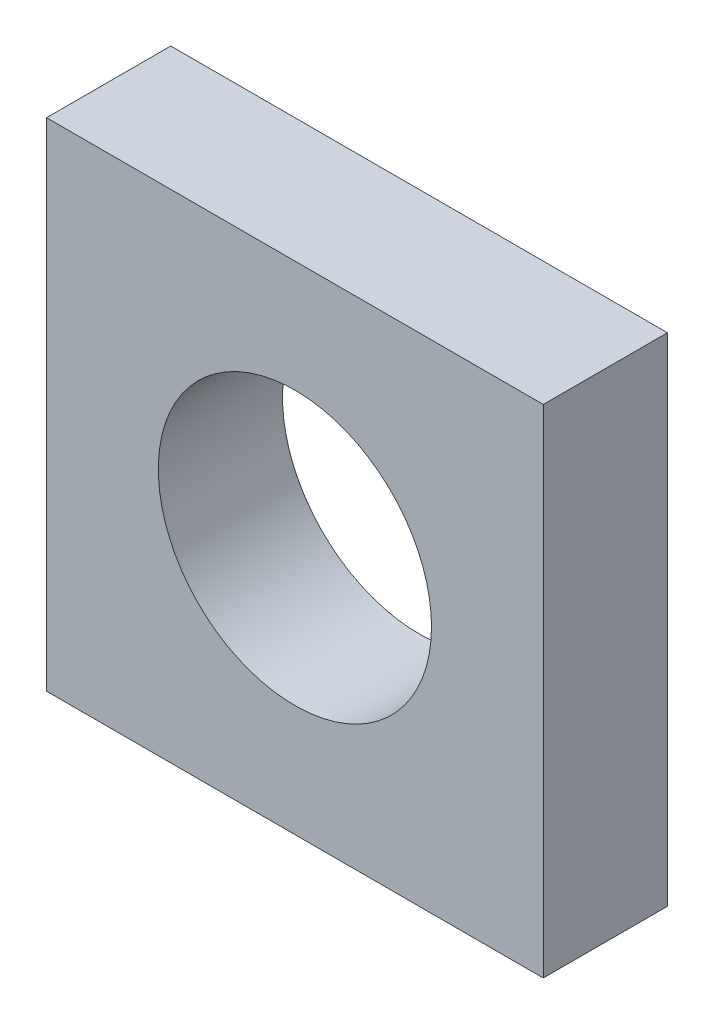
ISO-10303-21;
HEADER;
FILE_DESCRIPTION(('STEP AP214'),'2;1');
FILE_NAME('part.step','',(''),(''),'','','');
FILE_SCHEMA(('AUTOMOTIVE_DESIGN { 1 0 10303 214 1 1 1 1 }'));
ENDSEC;
DATA;
#1=APPLICATION_CONTEXT('core data for automotive mechanical design processes');
#2=APPLICATION_PROTOCOL_DEFINITION('international standard','automotive_design',2000,#1);
#3=PRODUCT_CONTEXT('',#1,'mechanical');
#4=PRODUCT('Part','Part','',(#3));
#5=PRODUCT_RELATED_PRODUCT_CATEGORY('part','',(#4));
#6=PRODUCT_DEFINITION_FORMATION('','',#4);
#7=PRODUCT_DEFINITION_CONTEXT('part definition',#1,'design');
#8=PRODUCT_DEFINITION('design','',#6,#7);
#9=PRODUCT_DEFINITION_SHAPE('','',#8);
#10=(LENGTH_UNIT() NAMED_UNIT(*) SI_UNIT(.MILLI.,.METRE.));
#11=(NAMED_UNIT(*) PLANE_ANGLE_UNIT() SI_UNIT($,.RADIAN.));
#12=(NAMED_UNIT(*) SI_UNIT($,.STERADIAN.) SOLID_ANGLE_UNIT());
#13=UNCERTAINTY_MEASURE_WITH_UNIT(LENGTH_MEASURE(1.E-05),#10,'distance_accuracy_value','');
#14=(GEOMETRIC_REPRESENTATION_CONTEXT(3) GLOBAL_UNCERTAINTY_ASSIGNED_CONTEXT((#13)) GLOBAL_UNIT_ASSIGNED_CONTEXT((#10,
#11,#12)) REPRESENTATION_CONTEXT('',''));
#15=CARTESIAN_POINT('',(0.,0.,0.));
#16=DIRECTION('',(0.,0.,1.));
#17=DIRECTION('',(1.,0.,0.));
#18=AXIS2_PLACEMENT_3D('',#15,#16,#17);
#19=CARTESIAN_POINT('',(0.,0.,10.));
#20=DIRECTION('',(0.,0.,-1.));
#21=DIRECTION('',(-1.,0.,0.));
#22=AXIS2_PLACEMENT_3D('',#19,#20,#21);
#23=PLANE('',#22);
#24=DIRECTION('',(0.,1.,0.));
#25=VECTOR('',#24,1.);
#26=CARTESIAN_POINT('',(20.,-20.,10.));
#27=LINE('',#26,#25);
#28=CARTESIAN_POINT('',(20.,-20.,10.));
#29=VERTEX_POINT('',#28);
#30=CARTESIAN_POINT('',(20.,20.,10.));
#31=VERTEX_POINT('',#30);
#32=EDGE_CURVE('E88',#29,#31,#27,.T.);
#33=ORIENTED_EDGE('',*,*,#32,.T.);
#34=DIRECTION('',(-1.,0.,0.));
#35=VECTOR('',#34,1.);
#36=CARTESIAN_POINT('',(-20.,20.,10.));
#37=LINE('',#36,#35);
#38=CARTESIAN_POINT('',(-20.,20.,10.));
#39=VERTEX_POINT('',#38);
#40=EDGE_CURVE('E83',#31,#39,#37,.T.);
#41=ORIENTED_EDGE('',*,*,#40,.T.);
#42=DIRECTION('',(0.,-1.,0.));
#43=VECTOR('',#42,1.);
#44=CARTESIAN_POINT('',(-20.,-20.,10.));
#45=LINE('',#44,#43);
#46=CARTESIAN_POINT('',(-20.,-20.,10.));
#47=VERTEX_POINT('',#46);
#48=EDGE_CURVE('E86',#39,#47,#45,.T.);
#49=ORIENTED_EDGE('',*,*,#48,.T.);
#50=DIRECTION('',(1.,0.,0.));
#51=VECTOR('',#50,1.);
#52=CARTESIAN_POINT('',(-20.,-20.,10.));
#53=LINE('',#52,#51);
#54=EDGE_CURVE('E53',#47,#29,#53,.T.);
#55=ORIENTED_EDGE('',*,*,#54,.T.);
#56=EDGE_LOOP('',(#33,#41,#49,#55));
#57=FACE_BOUND('',#56,.T.);
#58=CARTESIAN_POINT('',(0.,0.,10.));
#59=DIRECTION('',(0.,0.,1.));
#60=DIRECTION('',(1.,0.,0.));
#61=AXIS2_PLACEMENT_3D('',#58,#59,#60);
#62=CIRCLE('',#61,11.);
#63=CARTESIAN_POINT('',(11.,0.,10.));
#64=VERTEX_POINT('',#63);
#65=EDGE_CURVE('E103',#64,#64,#62,.T.);
#66=ORIENTED_EDGE('',*,*,#65,.F.);
#67=EDGE_LOOP('',(#66));
#68=FACE_BOUND('',#67,.T.);
#69=ADVANCED_FACE('F36',(#57,#68),#23,.F.);
#70=CARTESIAN_POINT('',(0.,0.,0.));
#71=DIRECTION('',(0.,0.,-1.));
#72=DIRECTION('',(-1.,0.,0.));
#73=AXIS2_PLACEMENT_3D('',#70,#71,#72);
#74=PLANE('',#73);
#75=DIRECTION('',(0.,1.,0.));
#76=VECTOR('',#75,1.);
#77=CARTESIAN_POINT('',(20.,-20.,0.));
#78=LINE('',#77,#76);
#79=CARTESIAN_POINT('',(20.,-20.,0.));
#80=VERTEX_POINT('',#79);
#81=CARTESIAN_POINT('',(20.,20.,0.));
#82=VERTEX_POINT('',#81);
#83=EDGE_CURVE('E100',#80,#82,#78,.T.);
#84=ORIENTED_EDGE('',*,*,#83,.F.);
#85=DIRECTION('',(1.,0.,0.));
#86=VECTOR('',#85,1.);
#87=CARTESIAN_POINT('',(-20.,-20.,0.));
#88=LINE('',#87,#86);
#89=CARTESIAN_POINT('',(-20.,-20.,0.));
#90=VERTEX_POINT('',#89);
#91=EDGE_CURVE('E76',#90,#80,#88,.T.);
#92=ORIENTED_EDGE('',*,*,#91,.F.);
#93=DIRECTION('',(0.,-1.,0.));
#94=VECTOR('',#93,1.);
#95=CARTESIAN_POINT('',(-20.,-20.,0.));
#96=LINE('',#95,#94);
#97=CARTESIAN_POINT('',(-20.,20.,0.));
#98=VERTEX_POINT('',#97);
#99=EDGE_CURVE('E70',#98,#90,#96,.T.);
#100=ORIENTED_EDGE('',*,*,#99,.F.);
#101=DIRECTION('',(-1.,0.,0.));
#102=VECTOR('',#101,1.);
#103=CARTESIAN_POINT('',(-20.,20.,0.));
#104=LINE('',#103,#102);
#105=EDGE_CURVE('E92',#82,#98,#104,.T.);
#106=ORIENTED_EDGE('',*,*,#105,.F.);
#107=EDGE_LOOP('',(#84,#92,#100,#106));
#108=FACE_BOUND('',#107,.T.);
#109=CARTESIAN_POINT('',(0.,0.,0.));
#110=DIRECTION('',(0.,0.,1.));
#111=DIRECTION('',(1.,0.,0.));
#112=AXIS2_PLACEMENT_3D('',#109,#110,#111);
#113=CIRCLE('',#112,11.);
#114=CARTESIAN_POINT('',(11.,0.,0.));
#115=VERTEX_POINT('',#114);
#116=EDGE_CURVE('E115',#115,#115,#113,.T.);
#117=ORIENTED_EDGE('',*,*,#116,.T.);
#118=EDGE_LOOP('',(#117));
#119=FACE_BOUND('',#118,.T.);
#120=ADVANCED_FACE('F111',(#108,#119),#74,.T.);
#121=CARTESIAN_POINT('',(20.,-20.,10.));
#122=DIRECTION('',(-1.,0.,0.));
#123=DIRECTION('',(0.,0.,1.));
#124=AXIS2_PLACEMENT_3D('',#121,#122,#123);
#125=PLANE('',#124);
#126=ORIENTED_EDGE('',*,*,#83,.T.);
#127=DIRECTION('',(0.,0.,-1.));
#128=VECTOR('',#127,1.);
#129=CARTESIAN_POINT('',(20.,20.,10.));
#130=LINE('',#129,#128);
#131=EDGE_CURVE('E11',#31,#82,#130,.T.);
#132=ORIENTED_EDGE('',*,*,#131,.F.);
#133=ORIENTED_EDGE('',*,*,#32,.F.);
#134=DIRECTION('',(0.,0.,-1.));
#135=VECTOR('',#134,1.);
#136=CARTESIAN_POINT('',(20.,-20.,10.));
#137=LINE('',#136,#135);
#138=EDGE_CURVE('E96',#29,#80,#137,.T.);
#139=ORIENTED_EDGE('',*,*,#138,.T.);
#140=EDGE_LOOP('',(#126,#132,#133,#139));
#141=FACE_BOUND('',#140,.T.);
#142=ADVANCED_FACE('F38',(#141),#125,.F.);
#143=CARTESIAN_POINT('',(-20.,20.,10.));
#144=DIRECTION('',(0.,-1.,0.));
#145=DIRECTION('',(0.,0.,-1.));
#146=AXIS2_PLACEMENT_3D('',#143,#144,#145);
#147=PLANE('',#146);
#148=ORIENTED_EDGE('',*,*,#105,.T.);
#149=DIRECTION('',(0.,0.,-1.));
#150=VECTOR('',#149,1.);
#151=CARTESIAN_POINT('',(-20.,20.,10.));
#152=LINE('',#151,#150);
#153=EDGE_CURVE('E45',#39,#98,#152,.T.);
#154=ORIENTED_EDGE('',*,*,#153,.F.);
#155=ORIENTED_EDGE('',*,*,#40,.F.);
#156=ORIENTED_EDGE('',*,*,#131,.T.);
#157=EDGE_LOOP('',(#148,#154,#155,#156));
#158=FACE_BOUND('',#157,.T.);
#159=ADVANCED_FACE('F91',(#158),#147,.F.);
#160=CARTESIAN_POINT('',(-20.,-20.,10.));
#161=DIRECTION('',(1.,0.,0.));
#162=DIRECTION('',(0.,0.,-1.));
#163=AXIS2_PLACEMENT_3D('',#160,#161,#162);
#164=PLANE('',#163);
#165=ORIENTED_EDGE('',*,*,#99,.T.);
#166=DIRECTION('',(0.,0.,-1.));
#167=VECTOR('',#166,1.);
#168=CARTESIAN_POINT('',(-20.,-20.,10.));
#169=LINE('',#168,#167);
#170=EDGE_CURVE('E93',#47,#90,#169,.T.);
#171=ORIENTED_EDGE('',*,*,#170,.F.);
#172=ORIENTED_EDGE('',*,*,#48,.F.);
#173=ORIENTED_EDGE('',*,*,#153,.T.);
#174=EDGE_LOOP('',(#165,#171,#172,#173));
#175=FACE_BOUND('',#174,.T.);
#176=ADVANCED_FACE('F94',(#175),#164,.F.);
#177=CARTESIAN_POINT('',(-20.,-20.,10.));
#178=DIRECTION('',(0.,1.,0.));
#179=DIRECTION('',(0.,0.,1.));
#180=AXIS2_PLACEMENT_3D('',#177,#178,#179);
#181=PLANE('',#180);
#182=ORIENTED_EDGE('',*,*,#91,.T.);
#183=ORIENTED_EDGE('',*,*,#138,.F.);
#184=ORIENTED_EDGE('',*,*,#54,.F.);
#185=ORIENTED_EDGE('',*,*,#170,.T.);
#186=EDGE_LOOP('',(#182,#183,#184,#185));
#187=FACE_BOUND('',#186,.T.);
#188=ADVANCED_FACE('F108',(#187),#181,.F.);
#189=CARTESIAN_POINT('',(0.,0.,10.));
#190=DIRECTION('',(0.,0.,-1.));
#191=DIRECTION('',(-1.,0.,0.));
#192=AXIS2_PLACEMENT_3D('',#189,#190,#191);
#193=CYLINDRICAL_SURFACE('',#192,11.);
#194=ORIENTED_EDGE('',*,*,#65,.T.);
#195=EDGE_LOOP('',(#194));
#196=FACE_BOUND('',#195,.T.);
#197=ORIENTED_EDGE('',*,*,#116,.F.);
#198=EDGE_LOOP('',(#197));
#199=FACE_BOUND('',#198,.T.);
#200=ADVANCED_FACE('F121',(#196,#199),#193,.F.);
#201=CLOSED_SHELL('',(#69,#120,#142,#159,#176,#188,#200));
#202=MANIFOLD_SOLID_BREP('B2',#201);
#203=ADVANCED_BREP_SHAPE_REPRESENTATION('',(#18,#202),#14);
#204=SHAPE_DEFINITION_REPRESENTATION(#9,#203);
ENDSEC;
END-ISO-10303-21;
